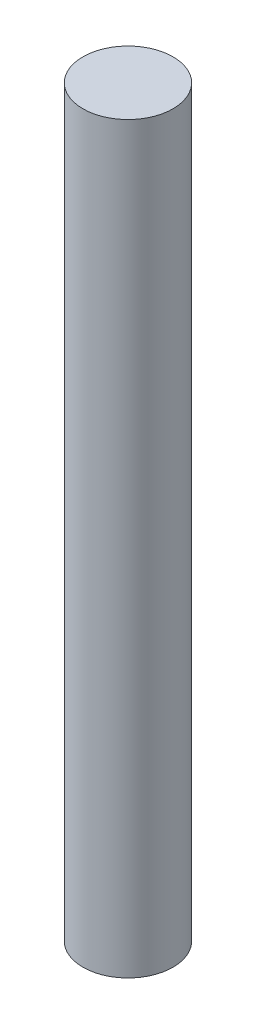
ISO-10303-21;
HEADER;
FILE_DESCRIPTION(('STEP AP214'),'2;1');
FILE_NAME('part.step','',(''),(''),'','','');
FILE_SCHEMA(('AUTOMOTIVE_DESIGN { 1 0 10303 214 1 1 1 1 }'));
ENDSEC;
DATA;
#1=APPLICATION_CONTEXT('core data for automotive mechanical design processes');
#2=APPLICATION_PROTOCOL_DEFINITION('international standard','automotive_design',2000,#1);
#3=PRODUCT_CONTEXT('',#1,'mechanical');
#4=PRODUCT('Part','Part','',(#3));
#5=PRODUCT_RELATED_PRODUCT_CATEGORY('part','',(#4));
#6=PRODUCT_DEFINITION_FORMATION('','',#4);
#7=PRODUCT_DEFINITION_CONTEXT('part definition',#1,'design');
#8=PRODUCT_DEFINITION('design','',#6,#7);
#9=PRODUCT_DEFINITION_SHAPE('','',#8);
#10=(LENGTH_UNIT() NAMED_UNIT(*) SI_UNIT(.MILLI.,.METRE.));
#11=(NAMED_UNIT(*) PLANE_ANGLE_UNIT() SI_UNIT($,.RADIAN.));
#12=(NAMED_UNIT(*) SI_UNIT($,.STERADIAN.) SOLID_ANGLE_UNIT());
#13=UNCERTAINTY_MEASURE_WITH_UNIT(LENGTH_MEASURE(1.E-05),#10,'distance_accuracy_value','');
#14=(GEOMETRIC_REPRESENTATION_CONTEXT(3) GLOBAL_UNCERTAINTY_ASSIGNED_CONTEXT((#13)) GLOBAL_UNIT_ASSIGNED_CONTEXT((#10,
#11,#12)) REPRESENTATION_CONTEXT('',''));
#15=CARTESIAN_POINT('',(0.,0.,0.));
#16=DIRECTION('',(0.,0.,1.));
#17=DIRECTION('',(1.,0.,0.));
#18=AXIS2_PLACEMENT_3D('',#15,#16,#17);
#19=CARTESIAN_POINT('',(0.,33.,0.));
#20=DIRECTION('',(0.,-1.,0.));
#21=DIRECTION('',(0.,0.,-1.));
#22=AXIS2_PLACEMENT_3D('',#19,#20,#21);
#23=CYLINDRICAL_SURFACE('',#22,4.);
#24=CARTESIAN_POINT('',(0.,33.,0.));
#25=DIRECTION('',(0.,1.,0.));
#26=DIRECTION('',(0.,0.,1.));
#27=AXIS2_PLACEMENT_3D('',#24,#25,#26);
#28=CIRCLE('',#27,4.);
#29=CARTESIAN_POINT('',(0.,33.,4.));
#30=VERTEX_POINT('',#29);
#31=EDGE_CURVE('E10',#30,#30,#28,.T.);
#32=ORIENTED_EDGE('',*,*,#31,.F.);
#33=EDGE_LOOP('',(#32));
#34=FACE_BOUND('',#33,.T.);
#35=CARTESIAN_POINT('',(0.,-33.,0.));
#36=DIRECTION('',(0.,1.,0.));
#37=DIRECTION('',(0.,0.,1.));
#38=AXIS2_PLACEMENT_3D('',#35,#36,#37);
#39=CIRCLE('',#38,4.);
#40=CARTESIAN_POINT('',(0.,-33.,4.));
#41=VERTEX_POINT('',#40);
#42=EDGE_CURVE('E46',#41,#41,#39,.T.);
#43=ORIENTED_EDGE('',*,*,#42,.T.);
#44=EDGE_LOOP('',(#43));
#45=FACE_BOUND('',#44,.T.);
#46=ADVANCED_FACE('F43',(#34,#45),#23,.T.);
#47=CARTESIAN_POINT('',(0.,33.,0.));
#48=DIRECTION('',(0.,1.,0.));
#49=DIRECTION('',(0.,0.,1.));
#50=AXIS2_PLACEMENT_3D('',#47,#48,#49);
#51=PLANE('',#50);
#52=ORIENTED_EDGE('',*,*,#31,.T.);
#53=EDGE_LOOP('',(#52));
#54=FACE_BOUND('',#53,.T.);
#55=ADVANCED_FACE('F60',(#54),#51,.T.);
#56=CARTESIAN_POINT('',(0.,-33.,0.));
#57=DIRECTION('',(0.,1.,0.));
#58=DIRECTION('',(0.,0.,1.));
#59=AXIS2_PLACEMENT_3D('',#56,#57,#58);
#60=PLANE('',#59);
#61=ORIENTED_EDGE('',*,*,#42,.F.);
#62=EDGE_LOOP('',(#61));
#63=FACE_BOUND('',#62,.T.);
#64=ADVANCED_FACE('F58',(#63),#60,.F.);
#65=CLOSED_SHELL('',(#46,#55,#64));
#66=MANIFOLD_SOLID_BREP('B2',#65);
#67=ADVANCED_BREP_SHAPE_REPRESENTATION('',(#18,#66),#14);
#68=SHAPE_DEFINITION_REPRESENTATION(#9,#67);
ENDSEC;
END-ISO-10303-21;
